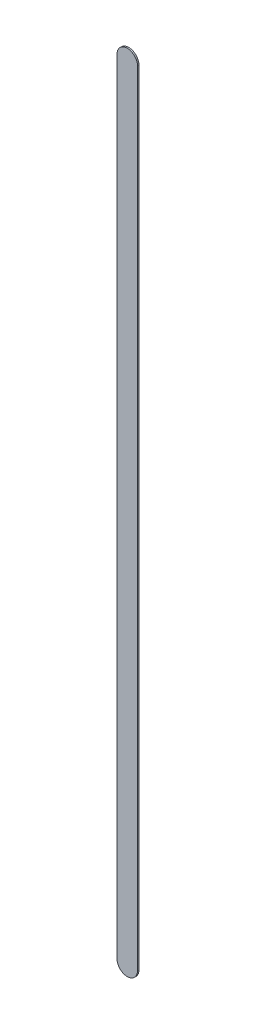
ISO-10303-21;
HEADER;
FILE_DESCRIPTION(('STEP AP214'),'2;1');
FILE_NAME('part.step','',(''),(''),'','','');
FILE_SCHEMA(('AUTOMOTIVE_DESIGN { 1 0 10303 214 1 1 1 1 }'));
ENDSEC;
DATA;
#1=APPLICATION_CONTEXT('core data for automotive mechanical design processes');
#2=APPLICATION_PROTOCOL_DEFINITION('international standard','automotive_design',2000,#1);
#3=PRODUCT_CONTEXT('',#1,'mechanical');
#4=PRODUCT('Part','Part','',(#3));
#5=PRODUCT_RELATED_PRODUCT_CATEGORY('part','',(#4));
#6=PRODUCT_DEFINITION_FORMATION('','',#4);
#7=PRODUCT_DEFINITION_CONTEXT('part definition',#1,'design');
#8=PRODUCT_DEFINITION('design','',#6,#7);
#9=PRODUCT_DEFINITION_SHAPE('','',#8);
#10=(LENGTH_UNIT() NAMED_UNIT(*) SI_UNIT(.MILLI.,.METRE.));
#11=(NAMED_UNIT(*) PLANE_ANGLE_UNIT() SI_UNIT($,.RADIAN.));
#12=(NAMED_UNIT(*) SI_UNIT($,.STERADIAN.) SOLID_ANGLE_UNIT());
#13=UNCERTAINTY_MEASURE_WITH_UNIT(LENGTH_MEASURE(1.E-05),#10,'distance_accuracy_value','');
#14=(GEOMETRIC_REPRESENTATION_CONTEXT(3) GLOBAL_UNCERTAINTY_ASSIGNED_CONTEXT((#13)) GLOBAL_UNIT_ASSIGNED_CONTEXT((#10,
#11,#12)) REPRESENTATION_CONTEXT('',''));
#15=CARTESIAN_POINT('',(0.,0.,0.));
#16=DIRECTION('',(0.,0.,1.));
#17=DIRECTION('',(1.,0.,0.));
#18=AXIS2_PLACEMENT_3D('',#15,#16,#17);
#19=CARTESIAN_POINT('',(46.14999914,77.93368716,0.));
#20=DIRECTION('',(-1.,0.,0.));
#21=DIRECTION('',(0.,1.,0.));
#22=AXIS2_PLACEMENT_3D('',#19,#20,#21);
#23=PLANE('',#22);
#24=DIRECTION('',(0.,1.,0.));
#25=VECTOR('',#24,1.);
#26=CARTESIAN_POINT('',(46.14999914,77.93368716,0.03556));
#27=LINE('',#26,#25);
#28=CARTESIAN_POINT('',(46.14999914,77.93368716,0.03556));
#29=VERTEX_POINT('',#28);
#30=CARTESIAN_POINT('',(46.14999914,97.03700684,0.03556));
#31=VERTEX_POINT('',#30);
#32=EDGE_CURVE('E11',#29,#31,#27,.T.);
#33=ORIENTED_EDGE('',*,*,#32,.F.);
#34=DIRECTION('',(0.,0.,1.));
#35=VECTOR('',#34,1.);
#36=CARTESIAN_POINT('',(46.14999914,77.93368716,0.));
#37=LINE('',#36,#35);
#38=CARTESIAN_POINT('',(46.14999914,77.93368716,0.));
#39=VERTEX_POINT('',#38);
#40=EDGE_CURVE('E24',#39,#29,#37,.T.);
#41=ORIENTED_EDGE('',*,*,#40,.F.);
#42=DIRECTION('',(0.,1.,0.));
#43=VECTOR('',#42,1.);
#44=CARTESIAN_POINT('',(46.14999914,77.93368716,0.));
#45=LINE('',#44,#43);
#46=CARTESIAN_POINT('',(46.14999914,97.03700684,0.));
#47=VERTEX_POINT('',#46);
#48=EDGE_CURVE('E75',#39,#47,#45,.T.);
#49=ORIENTED_EDGE('',*,*,#48,.T.);
#50=DIRECTION('',(0.,0.,1.));
#51=VECTOR('',#50,1.);
#52=CARTESIAN_POINT('',(46.14999914,97.03700684,0.));
#53=LINE('',#52,#51);
#54=EDGE_CURVE('E37',#47,#31,#53,.T.);
#55=ORIENTED_EDGE('',*,*,#54,.T.);
#56=EDGE_LOOP('',(#33,#41,#49,#55));
#57=FACE_BOUND('',#56,.T.);
#58=ADVANCED_FACE('F17',(#57),#23,.F.);
#59=CARTESIAN_POINT('',(45.89999964,97.03700684,0.));
#60=DIRECTION('',(0.,0.,-1.));
#61=DIRECTION('',(1.,0.,0.));
#62=AXIS2_PLACEMENT_3D('',#59,#60,#61);
#63=CYLINDRICAL_SURFACE('',#62,0.249999499999999);
#64=CARTESIAN_POINT('',(45.89999964,97.03700684,0.03556));
#65=DIRECTION('',(0.,0.,1.));
#66=DIRECTION('',(1.,0.,0.));
#67=AXIS2_PLACEMENT_3D('',#64,#65,#66);
#68=CIRCLE('',#67,0.249999499999999);
#69=CARTESIAN_POINT('',(45.65000014,97.03700684,0.03556));
#70=VERTEX_POINT('',#69);
#71=EDGE_CURVE('E83',#31,#70,#68,.T.);
#72=ORIENTED_EDGE('',*,*,#71,.F.);
#73=ORIENTED_EDGE('',*,*,#54,.F.);
#74=CARTESIAN_POINT('',(45.89999964,97.03700684,0.));
#75=DIRECTION('',(0.,0.,1.));
#76=DIRECTION('',(1.,0.,0.));
#77=AXIS2_PLACEMENT_3D('',#74,#75,#76);
#78=CIRCLE('',#77,0.249999499999999);
#79=CARTESIAN_POINT('',(45.65000014,97.03700684,0.));
#80=VERTEX_POINT('',#79);
#81=EDGE_CURVE('E81',#47,#80,#78,.T.);
#82=ORIENTED_EDGE('',*,*,#81,.T.);
#83=DIRECTION('',(0.,0.,1.));
#84=VECTOR('',#83,1.);
#85=CARTESIAN_POINT('',(45.65000014,97.03700684,0.));
#86=LINE('',#85,#84);
#87=EDGE_CURVE('E67',#80,#70,#86,.T.);
#88=ORIENTED_EDGE('',*,*,#87,.T.);
#89=EDGE_LOOP('',(#72,#73,#82,#88));
#90=FACE_BOUND('',#89,.T.);
#91=ADVANCED_FACE('F89',(#90),#63,.T.);
#92=CARTESIAN_POINT('',(45.65000014,97.03700684,0.));
#93=DIRECTION('',(1.,0.,0.));
#94=DIRECTION('',(0.,-1.,0.));
#95=AXIS2_PLACEMENT_3D('',#92,#93,#94);
#96=PLANE('',#95);
#97=DIRECTION('',(0.,-1.,0.));
#98=VECTOR('',#97,1.);
#99=CARTESIAN_POINT('',(45.65000014,97.03700684,0.03556));
#100=LINE('',#99,#98);
#101=CARTESIAN_POINT('',(45.65000014,77.93368716,0.03556));
#102=VERTEX_POINT('',#101);
#103=EDGE_CURVE('E71',#70,#102,#100,.T.);
#104=ORIENTED_EDGE('',*,*,#103,.F.);
#105=ORIENTED_EDGE('',*,*,#87,.F.);
#106=DIRECTION('',(0.,-1.,0.));
#107=VECTOR('',#106,1.);
#108=CARTESIAN_POINT('',(45.65000014,97.03700684,0.));
#109=LINE('',#108,#107);
#110=CARTESIAN_POINT('',(45.65000014,77.93368716,0.));
#111=VERTEX_POINT('',#110);
#112=EDGE_CURVE('E63',#80,#111,#109,.T.);
#113=ORIENTED_EDGE('',*,*,#112,.T.);
#114=DIRECTION('',(0.,0.,1.));
#115=VECTOR('',#114,1.);
#116=CARTESIAN_POINT('',(45.65000014,77.93368716,0.));
#117=LINE('',#116,#115);
#118=EDGE_CURVE('E53',#111,#102,#117,.T.);
#119=ORIENTED_EDGE('',*,*,#118,.T.);
#120=EDGE_LOOP('',(#104,#105,#113,#119));
#121=FACE_BOUND('',#120,.T.);
#122=ADVANCED_FACE('F66',(#121),#96,.F.);
#123=CARTESIAN_POINT('',(45.89999964,77.93368716,0.));
#124=DIRECTION('',(0.,0.,-1.));
#125=DIRECTION('',(-1.,0.,0.));
#126=AXIS2_PLACEMENT_3D('',#123,#124,#125);
#127=CYLINDRICAL_SURFACE('',#126,0.249999499999999);
#128=CARTESIAN_POINT('',(45.89999964,77.93368716,0.03556));
#129=DIRECTION('',(0.,0.,1.));
#130=DIRECTION('',(-1.,0.,0.));
#131=AXIS2_PLACEMENT_3D('',#128,#129,#130);
#132=CIRCLE('',#131,0.249999499999999);
#133=EDGE_CURVE('E59',#102,#29,#132,.T.);
#134=ORIENTED_EDGE('',*,*,#133,.F.);
#135=ORIENTED_EDGE('',*,*,#118,.F.);
#136=CARTESIAN_POINT('',(45.89999964,77.93368716,0.));
#137=DIRECTION('',(0.,0.,1.));
#138=DIRECTION('',(-1.,0.,0.));
#139=AXIS2_PLACEMENT_3D('',#136,#137,#138);
#140=CIRCLE('',#139,0.249999499999999);
#141=EDGE_CURVE('E57',#111,#39,#140,.T.);
#142=ORIENTED_EDGE('',*,*,#141,.T.);
#143=ORIENTED_EDGE('',*,*,#40,.T.);
#144=EDGE_LOOP('',(#134,#135,#142,#143));
#145=FACE_BOUND('',#144,.T.);
#146=ADVANCED_FACE('F55',(#145),#127,.T.);
#147=CARTESIAN_POINT('',(46.14999914,77.93368716,0.));
#148=DIRECTION('',(0.,0.,-1.));
#149=DIRECTION('',(-1.,0.,0.));
#150=AXIS2_PLACEMENT_3D('',#147,#148,#149);
#151=PLANE('',#150);
#152=ORIENTED_EDGE('',*,*,#141,.F.);
#153=ORIENTED_EDGE('',*,*,#112,.F.);
#154=ORIENTED_EDGE('',*,*,#81,.F.);
#155=ORIENTED_EDGE('',*,*,#48,.F.);
#156=EDGE_LOOP('',(#152,#153,#154,#155));
#157=FACE_BOUND('',#156,.T.);
#158=ADVANCED_FACE('F74',(#157),#151,.T.);
#159=CARTESIAN_POINT('',(46.14999914,77.93368716,0.03556));
#160=DIRECTION('',(0.,0.,-1.));
#161=DIRECTION('',(-1.,0.,0.));
#162=AXIS2_PLACEMENT_3D('',#159,#160,#161);
#163=PLANE('',#162);
#164=ORIENTED_EDGE('',*,*,#32,.T.);
#165=ORIENTED_EDGE('',*,*,#71,.T.);
#166=ORIENTED_EDGE('',*,*,#103,.T.);
#167=ORIENTED_EDGE('',*,*,#133,.T.);
#168=EDGE_LOOP('',(#164,#165,#166,#167));
#169=FACE_BOUND('',#168,.T.);
#170=ADVANCED_FACE('F91',(#169),#163,.F.);
#171=CLOSED_SHELL('',(#58,#91,#122,#146,#158,#170));
#172=MANIFOLD_SOLID_BREP('B1',#171);
#173=ADVANCED_BREP_SHAPE_REPRESENTATION('',(#18,#172),#14);
#174=SHAPE_DEFINITION_REPRESENTATION(#9,#173);
ENDSEC;
END-ISO-10303-21;
